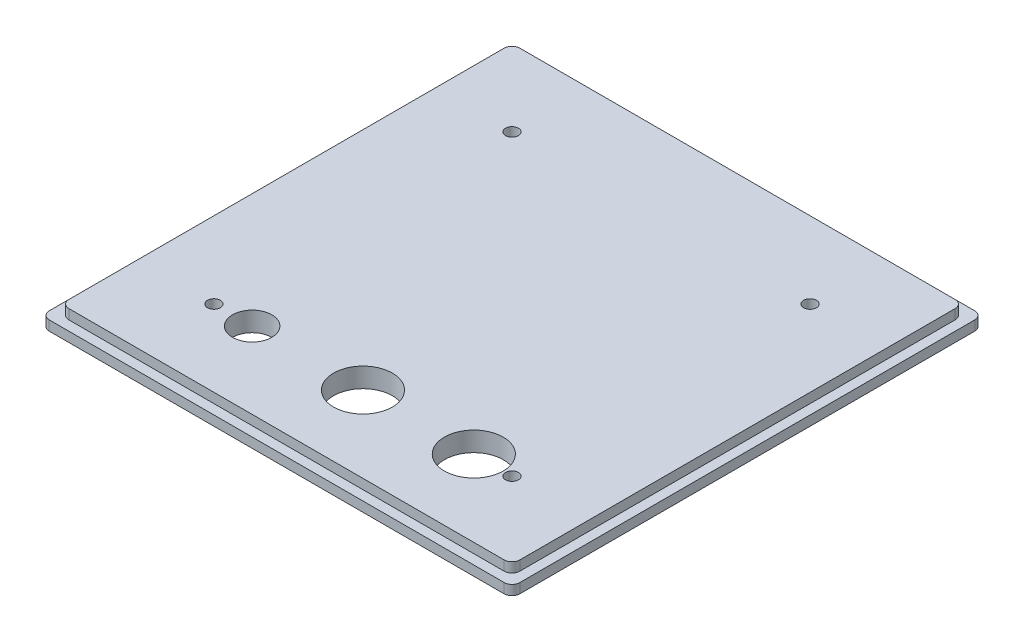
ISO-10303-21;
HEADER;
FILE_DESCRIPTION(('STEP AP214'),'2;1');
FILE_NAME('part.step','',(''),(''),'','','');
FILE_SCHEMA(('AUTOMOTIVE_DESIGN { 1 0 10303 214 1 1 1 1 }'));
ENDSEC;
DATA;
#1=APPLICATION_CONTEXT('core data for automotive mechanical design processes');
#2=APPLICATION_PROTOCOL_DEFINITION('international standard','automotive_design',2000,#1);
#3=PRODUCT_CONTEXT('',#1,'mechanical');
#4=PRODUCT('Part','Part','',(#3));
#5=PRODUCT_RELATED_PRODUCT_CATEGORY('part','',(#4));
#6=PRODUCT_DEFINITION_FORMATION('','',#4);
#7=PRODUCT_DEFINITION_CONTEXT('part definition',#1,'design');
#8=PRODUCT_DEFINITION('design','',#6,#7);
#9=PRODUCT_DEFINITION_SHAPE('','',#8);
#10=(LENGTH_UNIT() NAMED_UNIT(*) SI_UNIT(.MILLI.,.METRE.));
#11=(NAMED_UNIT(*) PLANE_ANGLE_UNIT() SI_UNIT($,.RADIAN.));
#12=(NAMED_UNIT(*) SI_UNIT($,.STERADIAN.) SOLID_ANGLE_UNIT());
#13=UNCERTAINTY_MEASURE_WITH_UNIT(LENGTH_MEASURE(1.E-05),#10,'distance_accuracy_value','');
#14=(GEOMETRIC_REPRESENTATION_CONTEXT(3) GLOBAL_UNCERTAINTY_ASSIGNED_CONTEXT((#13)) GLOBAL_UNIT_ASSIGNED_CONTEXT((#10,
#11,#12)) REPRESENTATION_CONTEXT('',''));
#15=CARTESIAN_POINT('',(0.,0.,0.));
#16=DIRECTION('',(0.,0.,1.));
#17=DIRECTION('',(1.,0.,0.));
#18=AXIS2_PLACEMENT_3D('',#15,#16,#17);
#19=CARTESIAN_POINT('',(38.005,-5.,-38.));
#20=DIRECTION('',(0.,1.,0.));
#21=DIRECTION('',(0.,0.,1.));
#22=AXIS2_PLACEMENT_3D('',#19,#20,#21);
#23=CYLINDRICAL_SURFACE('',#22,1.65);
#24=CARTESIAN_POINT('',(38.005,5.,-38.));
#25=DIRECTION('',(0.,1.,0.));
#26=DIRECTION('',(0.,0.,1.));
#27=AXIS2_PLACEMENT_3D('',#24,#25,#26);
#28=CIRCLE('',#27,1.65);
#29=CARTESIAN_POINT('',(38.005,5.,-36.35));
#30=VERTEX_POINT('',#29);
#31=EDGE_CURVE('E206',#30,#30,#28,.T.);
#32=ORIENTED_EDGE('',*,*,#31,.T.);
#33=EDGE_LOOP('',(#32));
#34=FACE_BOUND('',#33,.T.);
#35=CARTESIAN_POINT('',(38.005,2.40000000000001,-38.));
#36=DIRECTION('',(0.,-1.,0.));
#37=DIRECTION('',(1.,0.,0.));
#38=AXIS2_PLACEMENT_3D('',#35,#36,#37);
#39=CIRCLE('',#38,1.65);
#40=CARTESIAN_POINT('',(39.655,2.40000000000001,-38.));
#41=VERTEX_POINT('',#40);
#42=EDGE_CURVE('E213',#41,#41,#39,.F.);
#43=ORIENTED_EDGE('',*,*,#42,.F.);
#44=EDGE_LOOP('',(#43));
#45=FACE_BOUND('',#44,.T.);
#46=ADVANCED_FACE('F39',(#34,#45),#23,.F.);
#47=CARTESIAN_POINT('',(-38.005,-5.,-38.));
#48=DIRECTION('',(0.,1.,0.));
#49=DIRECTION('',(0.,0.,1.));
#50=AXIS2_PLACEMENT_3D('',#47,#48,#49);
#51=CYLINDRICAL_SURFACE('',#50,1.65);
#52=CARTESIAN_POINT('',(-38.005,5.,-38.));
#53=DIRECTION('',(0.,1.,0.));
#54=DIRECTION('',(0.,0.,1.));
#55=AXIS2_PLACEMENT_3D('',#52,#53,#54);
#56=CIRCLE('',#55,1.65);
#57=CARTESIAN_POINT('',(-38.005,5.,-36.35));
#58=VERTEX_POINT('',#57);
#59=EDGE_CURVE('E203',#58,#58,#56,.T.);
#60=ORIENTED_EDGE('',*,*,#59,.T.);
#61=EDGE_LOOP('',(#60));
#62=FACE_BOUND('',#61,.T.);
#63=CARTESIAN_POINT('',(-38.005,2.39999999999999,-38.));
#64=DIRECTION('',(0.,-1.,0.));
#65=DIRECTION('',(1.,0.,0.));
#66=AXIS2_PLACEMENT_3D('',#63,#64,#65);
#67=CIRCLE('',#66,1.65);
#68=CARTESIAN_POINT('',(-36.355,2.39999999999999,-38.));
#69=VERTEX_POINT('',#68);
#70=EDGE_CURVE('E338',#69,#69,#67,.F.);
#71=ORIENTED_EDGE('',*,*,#70,.F.);
#72=EDGE_LOOP('',(#71));
#73=FACE_BOUND('',#72,.T.);
#74=ADVANCED_FACE('F347',(#62,#73),#51,.F.);
#75=CARTESIAN_POINT('',(-38.005,-5.,38.));
#76=DIRECTION('',(0.,1.,0.));
#77=DIRECTION('',(0.,0.,1.));
#78=AXIS2_PLACEMENT_3D('',#75,#76,#77);
#79=CYLINDRICAL_SURFACE('',#78,1.65);
#80=CARTESIAN_POINT('',(-38.005,5.,38.));
#81=DIRECTION('',(0.,1.,0.));
#82=DIRECTION('',(0.,0.,1.));
#83=AXIS2_PLACEMENT_3D('',#80,#81,#82);
#84=CIRCLE('',#83,1.65);
#85=CARTESIAN_POINT('',(-38.005,5.,39.65));
#86=VERTEX_POINT('',#85);
#87=EDGE_CURVE('E207',#86,#86,#84,.T.);
#88=ORIENTED_EDGE('',*,*,#87,.T.);
#89=EDGE_LOOP('',(#88));
#90=FACE_BOUND('',#89,.T.);
#91=CARTESIAN_POINT('',(-38.005,2.39999999999999,38.));
#92=DIRECTION('',(0.,-1.,0.));
#93=DIRECTION('',(1.,0.,0.));
#94=AXIS2_PLACEMENT_3D('',#91,#92,#93);
#95=CIRCLE('',#94,1.65);
#96=CARTESIAN_POINT('',(-36.355,2.39999999999999,38.));
#97=VERTEX_POINT('',#96);
#98=EDGE_CURVE('E335',#97,#97,#95,.F.);
#99=ORIENTED_EDGE('',*,*,#98,.F.);
#100=EDGE_LOOP('',(#99));
#101=FACE_BOUND('',#100,.T.);
#102=ADVANCED_FACE('F353',(#90,#101),#79,.F.);
#103=CARTESIAN_POINT('',(38.005,-5.,38.));
#104=DIRECTION('',(0.,1.,0.));
#105=DIRECTION('',(0.,0.,1.));
#106=AXIS2_PLACEMENT_3D('',#103,#104,#105);
#107=CYLINDRICAL_SURFACE('',#106,1.65);
#108=CARTESIAN_POINT('',(38.005,5.,38.));
#109=DIRECTION('',(0.,1.,0.));
#110=DIRECTION('',(0.,0.,1.));
#111=AXIS2_PLACEMENT_3D('',#108,#109,#110);
#112=CIRCLE('',#111,1.65);
#113=CARTESIAN_POINT('',(38.005,5.,39.65));
#114=VERTEX_POINT('',#113);
#115=EDGE_CURVE('E210',#114,#114,#112,.T.);
#116=ORIENTED_EDGE('',*,*,#115,.T.);
#117=EDGE_LOOP('',(#116));
#118=FACE_BOUND('',#117,.T.);
#119=CARTESIAN_POINT('',(38.005,2.40000000000001,38.));
#120=DIRECTION('',(0.,-1.,0.));
#121=DIRECTION('',(1.,0.,0.));
#122=AXIS2_PLACEMENT_3D('',#119,#120,#121);
#123=CIRCLE('',#122,1.65);
#124=CARTESIAN_POINT('',(39.655,2.40000000000001,38.));
#125=VERTEX_POINT('',#124);
#126=EDGE_CURVE('E200',#125,#125,#123,.F.);
#127=ORIENTED_EDGE('',*,*,#126,.F.);
#128=EDGE_LOOP('',(#127));
#129=FACE_BOUND('',#128,.T.);
#130=ADVANCED_FACE('F358',(#118,#129),#107,.F.);
#131=CARTESIAN_POINT('',(60.,2.50000000000002,60.));
#132=DIRECTION('',(0.,-1.,0.));
#133=DIRECTION('',(1.,0.,0.));
#134=AXIS2_PLACEMENT_3D('',#131,#132,#133);
#135=PLANE('',#134);
#136=DIRECTION('',(-1.,0.,0.));
#137=VECTOR('',#136,1.);
#138=CARTESIAN_POINT('',(60.,2.50000000000002,-60.));
#139=LINE('',#138,#137);
#140=CARTESIAN_POINT('',(58.,2.50000000000002,-60.));
#141=VERTEX_POINT('',#140);
#142=CARTESIAN_POINT('',(-58.,2.49999999999999,-60.));
#143=VERTEX_POINT('',#142);
#144=EDGE_CURVE('E230',#141,#143,#139,.T.);
#145=ORIENTED_EDGE('',*,*,#144,.T.);
#146=CARTESIAN_POINT('',(-58.,2.49999999999999,-58.));
#147=DIRECTION('',(0.,-1.,0.));
#148=DIRECTION('',(1.,0.,0.));
#149=AXIS2_PLACEMENT_3D('',#146,#147,#148);
#150=CIRCLE('',#149,2.);
#151=CARTESIAN_POINT('',(-60.,2.49999999999999,-58.));
#152=VERTEX_POINT('',#151);
#153=EDGE_CURVE('E276',#143,#152,#150,.F.);
#154=ORIENTED_EDGE('',*,*,#153,.T.);
#155=DIRECTION('',(0.,0.,-1.));
#156=VECTOR('',#155,1.);
#157=CARTESIAN_POINT('',(-60.,2.49999999999999,60.));
#158=LINE('',#157,#156);
#159=CARTESIAN_POINT('',(-60.,2.49999999999999,58.));
#160=VERTEX_POINT('',#159);
#161=EDGE_CURVE('E261',#160,#152,#158,.T.);
#162=ORIENTED_EDGE('',*,*,#161,.F.);
#163=CARTESIAN_POINT('',(-58.,2.49999999999999,58.));
#164=DIRECTION('',(0.,-1.,0.));
#165=DIRECTION('',(1.,0.,0.));
#166=AXIS2_PLACEMENT_3D('',#163,#164,#165);
#167=CIRCLE('',#166,2.);
#168=CARTESIAN_POINT('',(-58.,2.49999999999999,60.));
#169=VERTEX_POINT('',#168);
#170=EDGE_CURVE('E274',#160,#169,#167,.F.);
#171=ORIENTED_EDGE('',*,*,#170,.T.);
#172=DIRECTION('',(-1.,0.,0.));
#173=VECTOR('',#172,1.);
#174=CARTESIAN_POINT('',(60.,2.50000000000002,60.));
#175=LINE('',#174,#173);
#176=CARTESIAN_POINT('',(58.,2.50000000000002,60.));
#177=VERTEX_POINT('',#176);
#178=EDGE_CURVE('E241',#177,#169,#175,.T.);
#179=ORIENTED_EDGE('',*,*,#178,.F.);
#180=CARTESIAN_POINT('',(58.,2.50000000000002,58.));
#181=DIRECTION('',(0.,-1.,0.));
#182=DIRECTION('',(1.,0.,0.));
#183=AXIS2_PLACEMENT_3D('',#180,#181,#182);
#184=CIRCLE('',#183,2.);
#185=CARTESIAN_POINT('',(60.,2.50000000000002,58.));
#186=VERTEX_POINT('',#185);
#187=EDGE_CURVE('E270',#177,#186,#184,.F.);
#188=ORIENTED_EDGE('',*,*,#187,.T.);
#189=DIRECTION('',(0.,0.,-1.));
#190=VECTOR('',#189,1.);
#191=CARTESIAN_POINT('',(60.,2.50000000000002,60.));
#192=LINE('',#191,#190);
#193=CARTESIAN_POINT('',(60.,2.50000000000002,-58.));
#194=VERTEX_POINT('',#193);
#195=EDGE_CURVE('E248',#186,#194,#192,.T.);
#196=ORIENTED_EDGE('',*,*,#195,.T.);
#197=CARTESIAN_POINT('',(58.,2.50000000000002,-58.));
#198=DIRECTION('',(0.,-1.,0.));
#199=DIRECTION('',(1.,0.,0.));
#200=AXIS2_PLACEMENT_3D('',#197,#198,#199);
#201=CIRCLE('',#200,2.);
#202=EDGE_CURVE('E272',#194,#141,#201,.F.);
#203=ORIENTED_EDGE('',*,*,#202,.T.);
#204=EDGE_LOOP('',(#145,#154,#162,#171,#179,#188,#196,#203));
#205=FACE_BOUND('',#204,.T.);
#206=DIRECTION('',(0.,0.,1.));
#207=VECTOR('',#206,1.);
#208=CARTESIAN_POINT('',(-57.5,2.5,-57.5));
#209=LINE('',#208,#207);
#210=CARTESIAN_POINT('',(-57.5,2.5,-55.5));
#211=VERTEX_POINT('',#210);
#212=CARTESIAN_POINT('',(-57.5,2.5,55.5));
#213=VERTEX_POINT('',#212);
#214=EDGE_CURVE('E216',#211,#213,#209,.T.);
#215=ORIENTED_EDGE('',*,*,#214,.F.);
#216=CARTESIAN_POINT('',(-55.5,2.49999999999999,-55.5));
#217=DIRECTION('',(0.,-1.,0.));
#218=DIRECTION('',(1.,0.,0.));
#219=AXIS2_PLACEMENT_3D('',#216,#217,#218);
#220=CIRCLE('',#219,2.);
#221=CARTESIAN_POINT('',(-55.5,2.5,-57.5));
#222=VERTEX_POINT('',#221);
#223=EDGE_CURVE('E329',#211,#222,#220,.T.);
#224=ORIENTED_EDGE('',*,*,#223,.T.);
#225=DIRECTION('',(1.,0.,0.));
#226=VECTOR('',#225,1.);
#227=CARTESIAN_POINT('',(-57.5,2.5,-57.5));
#228=LINE('',#227,#226);
#229=CARTESIAN_POINT('',(55.5,2.5,-57.5));
#230=VERTEX_POINT('',#229);
#231=EDGE_CURVE('E221',#222,#230,#228,.T.);
#232=ORIENTED_EDGE('',*,*,#231,.T.);
#233=CARTESIAN_POINT('',(55.5,2.50000000000002,-55.5));
#234=DIRECTION('',(0.,-1.,0.));
#235=DIRECTION('',(1.,0.,0.));
#236=AXIS2_PLACEMENT_3D('',#233,#234,#235);
#237=CIRCLE('',#236,2.);
#238=CARTESIAN_POINT('',(57.5,2.5,-55.5));
#239=VERTEX_POINT('',#238);
#240=EDGE_CURVE('E169',#230,#239,#237,.T.);
#241=ORIENTED_EDGE('',*,*,#240,.T.);
#242=DIRECTION('',(0.,0.,1.));
#243=VECTOR('',#242,1.);
#244=CARTESIAN_POINT('',(57.5,2.5,-57.5));
#245=LINE('',#244,#243);
#246=CARTESIAN_POINT('',(57.5,2.5,55.5));
#247=VERTEX_POINT('',#246);
#248=EDGE_CURVE('E236',#239,#247,#245,.T.);
#249=ORIENTED_EDGE('',*,*,#248,.T.);
#250=CARTESIAN_POINT('',(55.5,2.50000000000002,55.5));
#251=DIRECTION('',(0.,-1.,0.));
#252=DIRECTION('',(1.,0.,0.));
#253=AXIS2_PLACEMENT_3D('',#250,#251,#252);
#254=CIRCLE('',#253,2.);
#255=CARTESIAN_POINT('',(55.5,2.5,57.5));
#256=VERTEX_POINT('',#255);
#257=EDGE_CURVE('E62',#247,#256,#254,.T.);
#258=ORIENTED_EDGE('',*,*,#257,.T.);
#259=DIRECTION('',(-1.,0.,0.));
#260=VECTOR('',#259,1.);
#261=CARTESIAN_POINT('',(57.5,2.5,57.5));
#262=LINE('',#261,#260);
#263=CARTESIAN_POINT('',(-55.5,2.5,57.5));
#264=VERTEX_POINT('',#263);
#265=EDGE_CURVE('E233',#256,#264,#262,.T.);
#266=ORIENTED_EDGE('',*,*,#265,.T.);
#267=CARTESIAN_POINT('',(-55.5,2.49999999999999,55.5));
#268=DIRECTION('',(0.,-1.,0.));
#269=DIRECTION('',(1.,0.,0.));
#270=AXIS2_PLACEMENT_3D('',#267,#268,#269);
#271=CIRCLE('',#270,2.);
#272=EDGE_CURVE('E327',#264,#213,#271,.T.);
#273=ORIENTED_EDGE('',*,*,#272,.T.);
#274=EDGE_LOOP('',(#215,#224,#232,#241,#249,#258,#266,#273));
#275=FACE_BOUND('',#274,.T.);
#276=ADVANCED_FACE('F401',(#205,#275),#135,.F.);
#277=CARTESIAN_POINT('',(-60.,0.,60.));
#278=DIRECTION('',(-1.,0.,0.));
#279=DIRECTION('',(0.,0.,1.));
#280=AXIS2_PLACEMENT_3D('',#277,#278,#279);
#281=PLANE('',#280);
#282=ORIENTED_EDGE('',*,*,#161,.T.);
#283=DIRECTION('',(0.,1.,0.));
#284=VECTOR('',#283,1.);
#285=CARTESIAN_POINT('',(-60.,0.,-58.));
#286=LINE('',#285,#284);
#287=CARTESIAN_POINT('',(-60.,0.,-58.));
#288=VERTEX_POINT('',#287);
#289=EDGE_CURVE('E281',#152,#288,#286,.F.);
#290=ORIENTED_EDGE('',*,*,#289,.T.);
#291=DIRECTION('',(0.,0.,-1.));
#292=VECTOR('',#291,1.);
#293=CARTESIAN_POINT('',(-60.,0.,60.));
#294=LINE('',#293,#292);
#295=CARTESIAN_POINT('',(-60.,0.,58.));
#296=VERTEX_POINT('',#295);
#297=EDGE_CURVE('E258',#296,#288,#294,.T.);
#298=ORIENTED_EDGE('',*,*,#297,.F.);
#299=DIRECTION('',(0.,1.,0.));
#300=VECTOR('',#299,1.);
#301=CARTESIAN_POINT('',(-60.,2.49999999999999,58.));
#302=LINE('',#301,#300);
#303=EDGE_CURVE('E278',#296,#160,#302,.T.);
#304=ORIENTED_EDGE('',*,*,#303,.T.);
#305=EDGE_LOOP('',(#282,#290,#298,#304));
#306=FACE_BOUND('',#305,.T.);
#307=ADVANCED_FACE('F397',(#306),#281,.T.);
#308=CARTESIAN_POINT('',(60.,0.,60.));
#309=DIRECTION('',(0.,-1.,0.));
#310=DIRECTION('',(1.,0.,0.));
#311=AXIS2_PLACEMENT_3D('',#308,#309,#310);
#312=PLANE('',#311);
#313=CARTESIAN_POINT('',(-28.26,0.,38.));
#314=DIRECTION('',(0.,-1.,0.));
#315=DIRECTION('',(1.,0.,0.));
#316=AXIS2_PLACEMENT_3D('',#313,#314,#315);
#317=CIRCLE('',#316,5.);
#318=CARTESIAN_POINT('',(-23.26,0.,38.));
#319=VERTEX_POINT('',#318);
#320=EDGE_CURVE('E686',#319,#319,#317,.T.);
#321=ORIENTED_EDGE('',*,*,#320,.F.);
#322=EDGE_LOOP('',(#321));
#323=FACE_BOUND('',#322,.T.);
#324=CARTESIAN_POINT('',(28.26,0.,38.));
#325=DIRECTION('',(0.,-1.,0.));
#326=DIRECTION('',(1.,0.,0.));
#327=AXIS2_PLACEMENT_3D('',#324,#325,#326);
#328=CIRCLE('',#327,7.49999999999999);
#329=CARTESIAN_POINT('',(35.476650846588,0.,40.0420456798124));
#330=VERTEX_POINT('',#329);
#331=CARTESIAN_POINT('',(35.476650846588,0.,35.9579543201875));
#332=VERTEX_POINT('',#331);
#333=EDGE_CURVE('E164',#330,#332,#328,.T.);
#334=ORIENTED_EDGE('',*,*,#333,.F.);
#335=CARTESIAN_POINT('',(38.005,0.,38.));
#336=DIRECTION('',(0.,-1.,0.));
#337=DIRECTION('',(1.,0.,0.));
#338=AXIS2_PLACEMENT_3D('',#335,#336,#337);
#339=CIRCLE('',#338,3.25);
#340=EDGE_CURVE('E174',#332,#330,#339,.T.);
#341=ORIENTED_EDGE('',*,*,#340,.F.);
#342=EDGE_LOOP('',(#334,#341));
#343=FACE_BOUND('',#342,.T.);
#344=CARTESIAN_POINT('',(0.,0.,38.));
#345=DIRECTION('',(0.,-1.,0.));
#346=DIRECTION('',(1.,0.,0.));
#347=AXIS2_PLACEMENT_3D('',#344,#345,#346);
#348=CIRCLE('',#347,7.5);
#349=CARTESIAN_POINT('',(7.5,0.,38.));
#350=VERTEX_POINT('',#349);
#351=EDGE_CURVE('E693',#350,#350,#348,.T.);
#352=ORIENTED_EDGE('',*,*,#351,.F.);
#353=EDGE_LOOP('',(#352));
#354=FACE_BOUND('',#353,.T.);
#355=CARTESIAN_POINT('',(-38.005,0.,-38.));
#356=DIRECTION('',(0.,-1.,0.));
#357=DIRECTION('',(1.,0.,0.));
#358=AXIS2_PLACEMENT_3D('',#355,#356,#357);
#359=CIRCLE('',#358,3.25);
#360=CARTESIAN_POINT('',(-34.755,0.,-38.));
#361=VERTEX_POINT('',#360);
#362=EDGE_CURVE('E194',#361,#361,#359,.T.);
#363=ORIENTED_EDGE('',*,*,#362,.F.);
#364=EDGE_LOOP('',(#363));
#365=FACE_BOUND('',#364,.T.);
#366=CARTESIAN_POINT('',(38.005,0.,-38.));
#367=DIRECTION('',(0.,-1.,0.));
#368=DIRECTION('',(1.,0.,0.));
#369=AXIS2_PLACEMENT_3D('',#366,#367,#368);
#370=CIRCLE('',#369,3.25);
#371=CARTESIAN_POINT('',(41.255,0.,-38.));
#372=VERTEX_POINT('',#371);
#373=EDGE_CURVE('E185',#372,#372,#370,.T.);
#374=ORIENTED_EDGE('',*,*,#373,.F.);
#375=EDGE_LOOP('',(#374));
#376=FACE_BOUND('',#375,.T.);
#377=CARTESIAN_POINT('',(-38.005,0.,38.));
#378=DIRECTION('',(0.,-1.,0.));
#379=DIRECTION('',(1.,0.,0.));
#380=AXIS2_PLACEMENT_3D('',#377,#378,#379);
#381=CIRCLE('',#380,3.25);
#382=CARTESIAN_POINT('',(-34.755,0.,38.));
#383=VERTEX_POINT('',#382);
#384=EDGE_CURVE('E182',#383,#383,#381,.T.);
#385=ORIENTED_EDGE('',*,*,#384,.F.);
#386=EDGE_LOOP('',(#385));
#387=FACE_BOUND('',#386,.T.);
#388=ORIENTED_EDGE('',*,*,#297,.T.);
#389=CARTESIAN_POINT('',(-58.,0.,-58.));
#390=DIRECTION('',(0.,-1.,0.));
#391=DIRECTION('',(1.,0.,0.));
#392=AXIS2_PLACEMENT_3D('',#389,#390,#391);
#393=CIRCLE('',#392,2.);
#394=CARTESIAN_POINT('',(-58.,0.,-60.));
#395=VERTEX_POINT('',#394);
#396=EDGE_CURVE('E289',#288,#395,#393,.T.);
#397=ORIENTED_EDGE('',*,*,#396,.T.);
#398=DIRECTION('',(-1.,0.,0.));
#399=VECTOR('',#398,1.);
#400=CARTESIAN_POINT('',(60.,0.,-60.));
#401=LINE('',#400,#399);
#402=CARTESIAN_POINT('',(58.,0.,-60.));
#403=VERTEX_POINT('',#402);
#404=EDGE_CURVE('E245',#403,#395,#401,.T.);
#405=ORIENTED_EDGE('',*,*,#404,.F.);
#406=CARTESIAN_POINT('',(58.,0.,-58.));
#407=DIRECTION('',(0.,-1.,0.));
#408=DIRECTION('',(1.,0.,0.));
#409=AXIS2_PLACEMENT_3D('',#406,#407,#408);
#410=CIRCLE('',#409,2.);
#411=CARTESIAN_POINT('',(60.,0.,-58.));
#412=VERTEX_POINT('',#411);
#413=EDGE_CURVE('E285',#403,#412,#410,.T.);
#414=ORIENTED_EDGE('',*,*,#413,.T.);
#415=DIRECTION('',(0.,0.,-1.));
#416=VECTOR('',#415,1.);
#417=CARTESIAN_POINT('',(60.,0.,60.));
#418=LINE('',#417,#416);
#419=CARTESIAN_POINT('',(60.,0.,58.));
#420=VERTEX_POINT('',#419);
#421=EDGE_CURVE('E255',#420,#412,#418,.T.);
#422=ORIENTED_EDGE('',*,*,#421,.F.);
#423=CARTESIAN_POINT('',(58.,0.,58.));
#424=DIRECTION('',(0.,-1.,0.));
#425=DIRECTION('',(1.,0.,0.));
#426=AXIS2_PLACEMENT_3D('',#423,#424,#425);
#427=CIRCLE('',#426,2.);
#428=CARTESIAN_POINT('',(58.,0.,60.));
#429=VERTEX_POINT('',#428);
#430=EDGE_CURVE('E283',#420,#429,#427,.T.);
#431=ORIENTED_EDGE('',*,*,#430,.T.);
#432=DIRECTION('',(-1.,0.,0.));
#433=VECTOR('',#432,1.);
#434=CARTESIAN_POINT('',(60.,0.,60.));
#435=LINE('',#434,#433);
#436=CARTESIAN_POINT('',(-58.,0.,60.));
#437=VERTEX_POINT('',#436);
#438=EDGE_CURVE('E244',#429,#437,#435,.T.);
#439=ORIENTED_EDGE('',*,*,#438,.T.);
#440=CARTESIAN_POINT('',(-58.,0.,58.));
#441=DIRECTION('',(0.,-1.,0.));
#442=DIRECTION('',(1.,0.,0.));
#443=AXIS2_PLACEMENT_3D('',#440,#441,#442);
#444=CIRCLE('',#443,2.);
#445=EDGE_CURVE('E287',#437,#296,#444,.T.);
#446=ORIENTED_EDGE('',*,*,#445,.T.);
#447=EDGE_LOOP('',(#388,#397,#405,#414,#422,#431,#439,#446));
#448=FACE_BOUND('',#447,.T.);
#449=ADVANCED_FACE('F172',(#323,#343,#354,#365,#376,#387,#448),#312,.T.);
#450=CARTESIAN_POINT('',(60.,2.50000000000002,60.));
#451=DIRECTION('',(1.,0.,0.));
#452=DIRECTION('',(0.,0.,-1.));
#453=AXIS2_PLACEMENT_3D('',#450,#451,#452);
#454=PLANE('',#453);
#455=ORIENTED_EDGE('',*,*,#421,.T.);
#456=DIRECTION('',(0.,-1.,0.));
#457=VECTOR('',#456,1.);
#458=CARTESIAN_POINT('',(60.,2.50000000000002,-58.));
#459=LINE('',#458,#457);
#460=EDGE_CURVE('E298',#412,#194,#459,.F.);
#461=ORIENTED_EDGE('',*,*,#460,.T.);
#462=ORIENTED_EDGE('',*,*,#195,.F.);
#463=DIRECTION('',(0.,-1.,0.));
#464=VECTOR('',#463,1.);
#465=CARTESIAN_POINT('',(60.,0.,58.));
#466=LINE('',#465,#464);
#467=EDGE_CURVE('E295',#186,#420,#466,.T.);
#468=ORIENTED_EDGE('',*,*,#467,.T.);
#469=EDGE_LOOP('',(#455,#461,#462,#468));
#470=FACE_BOUND('',#469,.T.);
#471=ADVANCED_FACE('F386',(#470),#454,.T.);
#472=CARTESIAN_POINT('',(0.,0.,60.));
#473=DIRECTION('',(0.,0.,-1.));
#474=DIRECTION('',(-1.,0.,0.));
#475=AXIS2_PLACEMENT_3D('',#472,#473,#474);
#476=PLANE('',#475);
#477=ORIENTED_EDGE('',*,*,#178,.T.);
#478=DIRECTION('',(0.,1.,0.));
#479=VECTOR('',#478,1.);
#480=CARTESIAN_POINT('',(-58.,0.,60.));
#481=LINE('',#480,#479);
#482=EDGE_CURVE('E293',#169,#437,#481,.F.);
#483=ORIENTED_EDGE('',*,*,#482,.T.);
#484=ORIENTED_EDGE('',*,*,#438,.F.);
#485=DIRECTION('',(0.,-1.,0.));
#486=VECTOR('',#485,1.);
#487=CARTESIAN_POINT('',(58.,2.50000000000002,60.));
#488=LINE('',#487,#486);
#489=EDGE_CURVE('E291',#429,#177,#488,.F.);
#490=ORIENTED_EDGE('',*,*,#489,.T.);
#491=EDGE_LOOP('',(#477,#483,#484,#490));
#492=FACE_BOUND('',#491,.T.);
#493=ADVANCED_FACE('F382',(#492),#476,.F.);
#494=CARTESIAN_POINT('',(0.,0.,-60.));
#495=DIRECTION('',(0.,0.,-1.));
#496=DIRECTION('',(-1.,0.,0.));
#497=AXIS2_PLACEMENT_3D('',#494,#495,#496);
#498=PLANE('',#497);
#499=ORIENTED_EDGE('',*,*,#404,.T.);
#500=DIRECTION('',(0.,1.,0.));
#501=VECTOR('',#500,1.);
#502=CARTESIAN_POINT('',(-58.,0.,-60.));
#503=LINE('',#502,#501);
#504=EDGE_CURVE('E267',#395,#143,#503,.T.);
#505=ORIENTED_EDGE('',*,*,#504,.T.);
#506=ORIENTED_EDGE('',*,*,#144,.F.);
#507=DIRECTION('',(0.,-1.,0.));
#508=VECTOR('',#507,1.);
#509=CARTESIAN_POINT('',(58.,0.,-60.));
#510=LINE('',#509,#508);
#511=EDGE_CURVE('E264',#141,#403,#510,.T.);
#512=ORIENTED_EDGE('',*,*,#511,.T.);
#513=EDGE_LOOP('',(#499,#505,#506,#512));
#514=FACE_BOUND('',#513,.T.);
#515=ADVANCED_FACE('F385',(#514),#498,.T.);
#516=CARTESIAN_POINT('',(-58.,0.,-58.));
#517=DIRECTION('',(0.,1.,0.));
#518=DIRECTION('',(0.,0.,1.));
#519=AXIS2_PLACEMENT_3D('',#516,#517,#518);
#520=CYLINDRICAL_SURFACE('',#519,2.);
#521=ORIENTED_EDGE('',*,*,#396,.F.);
#522=ORIENTED_EDGE('',*,*,#289,.F.);
#523=ORIENTED_EDGE('',*,*,#153,.F.);
#524=ORIENTED_EDGE('',*,*,#504,.F.);
#525=EDGE_LOOP('',(#521,#522,#523,#524));
#526=FACE_BOUND('',#525,.T.);
#527=ADVANCED_FACE('F390',(#526),#520,.T.);
#528=CARTESIAN_POINT('',(-58.,0.,58.));
#529=DIRECTION('',(0.,-1.,0.));
#530=DIRECTION('',(0.,0.,-1.));
#531=AXIS2_PLACEMENT_3D('',#528,#529,#530);
#532=CYLINDRICAL_SURFACE('',#531,2.);
#533=ORIENTED_EDGE('',*,*,#445,.F.);
#534=ORIENTED_EDGE('',*,*,#482,.F.);
#535=ORIENTED_EDGE('',*,*,#170,.F.);
#536=ORIENTED_EDGE('',*,*,#303,.F.);
#537=EDGE_LOOP('',(#533,#534,#535,#536));
#538=FACE_BOUND('',#537,.T.);
#539=ADVANCED_FACE('F408',(#538),#532,.T.);
#540=CARTESIAN_POINT('',(58.,0.,-58.));
#541=DIRECTION('',(0.,-1.,0.));
#542=DIRECTION('',(0.,0.,-1.));
#543=AXIS2_PLACEMENT_3D('',#540,#541,#542);
#544=CYLINDRICAL_SURFACE('',#543,2.);
#545=ORIENTED_EDGE('',*,*,#202,.F.);
#546=ORIENTED_EDGE('',*,*,#460,.F.);
#547=ORIENTED_EDGE('',*,*,#413,.F.);
#548=ORIENTED_EDGE('',*,*,#511,.F.);
#549=EDGE_LOOP('',(#545,#546,#547,#548));
#550=FACE_BOUND('',#549,.T.);
#551=ADVANCED_FACE('F412',(#550),#544,.T.);
#552=CARTESIAN_POINT('',(58.,2.50000000000002,58.));
#553=DIRECTION('',(0.,1.,0.));
#554=DIRECTION('',(0.,0.,1.));
#555=AXIS2_PLACEMENT_3D('',#552,#553,#554);
#556=CYLINDRICAL_SURFACE('',#555,2.);
#557=ORIENTED_EDGE('',*,*,#187,.F.);
#558=ORIENTED_EDGE('',*,*,#489,.F.);
#559=ORIENTED_EDGE('',*,*,#430,.F.);
#560=ORIENTED_EDGE('',*,*,#467,.F.);
#561=EDGE_LOOP('',(#557,#558,#559,#560));
#562=FACE_BOUND('',#561,.T.);
#563=ADVANCED_FACE('F380',(#562),#556,.T.);
#564=CARTESIAN_POINT('',(-57.5,5.,-57.5));
#565=DIRECTION('',(1.,0.,0.));
#566=DIRECTION('',(0.,0.,-1.));
#567=AXIS2_PLACEMENT_3D('',#564,#565,#566);
#568=PLANE('',#567);
#569=ORIENTED_EDGE('',*,*,#214,.T.);
#570=DIRECTION('',(0.,-1.,0.));
#571=VECTOR('',#570,1.);
#572=CARTESIAN_POINT('',(-57.5,5.,55.5));
#573=LINE('',#572,#571);
#574=CARTESIAN_POINT('',(-57.5,5.,55.5));
#575=VERTEX_POINT('',#574);
#576=EDGE_CURVE('E308',#213,#575,#573,.F.);
#577=ORIENTED_EDGE('',*,*,#576,.T.);
#578=DIRECTION('',(0.,0.,1.));
#579=VECTOR('',#578,1.);
#580=CARTESIAN_POINT('',(-57.5,5.,-57.5));
#581=LINE('',#580,#579);
#582=CARTESIAN_POINT('',(-57.5,5.,-55.5));
#583=VERTEX_POINT('',#582);
#584=EDGE_CURVE('E217',#583,#575,#581,.T.);
#585=ORIENTED_EDGE('',*,*,#584,.F.);
#586=DIRECTION('',(0.,-1.,0.));
#587=VECTOR('',#586,1.);
#588=CARTESIAN_POINT('',(-57.5,2.5,-55.5));
#589=LINE('',#588,#587);
#590=EDGE_CURVE('E305',#583,#211,#589,.T.);
#591=ORIENTED_EDGE('',*,*,#590,.T.);
#592=EDGE_LOOP('',(#569,#577,#585,#591));
#593=FACE_BOUND('',#592,.T.);
#594=ADVANCED_FACE('F376',(#593),#568,.F.);
#595=CARTESIAN_POINT('',(57.5,5.,57.5));
#596=DIRECTION('',(0.,0.,1.));
#597=DIRECTION('',(1.,0.,0.));
#598=AXIS2_PLACEMENT_3D('',#595,#596,#597);
#599=PLANE('',#598);
#600=DIRECTION('',(-1.,0.,0.));
#601=VECTOR('',#600,1.);
#602=CARTESIAN_POINT('',(57.5,5.,57.5));
#603=LINE('',#602,#601);
#604=CARTESIAN_POINT('',(55.5,5.,57.5));
#605=VERTEX_POINT('',#604);
#606=CARTESIAN_POINT('',(-55.5,5.,57.5));
#607=VERTEX_POINT('',#606);
#608=EDGE_CURVE('E220',#605,#607,#603,.T.);
#609=ORIENTED_EDGE('',*,*,#608,.T.);
#610=DIRECTION('',(0.,-1.,0.));
#611=VECTOR('',#610,1.);
#612=CARTESIAN_POINT('',(-55.5,2.5,57.5));
#613=LINE('',#612,#611);
#614=EDGE_CURVE('E302',#607,#264,#613,.T.);
#615=ORIENTED_EDGE('',*,*,#614,.T.);
#616=ORIENTED_EDGE('',*,*,#265,.F.);
#617=DIRECTION('',(0.,-1.,0.));
#618=VECTOR('',#617,1.);
#619=CARTESIAN_POINT('',(55.5,5.,57.5));
#620=LINE('',#619,#618);
#621=EDGE_CURVE('E300',#256,#605,#620,.F.);
#622=ORIENTED_EDGE('',*,*,#621,.T.);
#623=EDGE_LOOP('',(#609,#615,#616,#622));
#624=FACE_BOUND('',#623,.T.);
#625=ADVANCED_FACE('F372',(#624),#599,.T.);
#626=CARTESIAN_POINT('',(57.5,5.,-57.5));
#627=DIRECTION('',(1.,0.,0.));
#628=DIRECTION('',(0.,0.,-1.));
#629=AXIS2_PLACEMENT_3D('',#626,#627,#628);
#630=PLANE('',#629);
#631=DIRECTION('',(0.,0.,1.));
#632=VECTOR('',#631,1.);
#633=CARTESIAN_POINT('',(57.5,5.,-57.5));
#634=LINE('',#633,#632);
#635=CARTESIAN_POINT('',(57.5,5.,-55.5));
#636=VERTEX_POINT('',#635);
#637=CARTESIAN_POINT('',(57.5,5.,55.5));
#638=VERTEX_POINT('',#637);
#639=EDGE_CURVE('E224',#636,#638,#634,.T.);
#640=ORIENTED_EDGE('',*,*,#639,.T.);
#641=DIRECTION('',(0.,-1.,0.));
#642=VECTOR('',#641,1.);
#643=CARTESIAN_POINT('',(57.5,5.,55.5));
#644=LINE('',#643,#642);
#645=EDGE_CURVE('E325',#638,#247,#644,.T.);
#646=ORIENTED_EDGE('',*,*,#645,.T.);
#647=ORIENTED_EDGE('',*,*,#248,.F.);
#648=DIRECTION('',(0.,-1.,0.));
#649=VECTOR('',#648,1.);
#650=CARTESIAN_POINT('',(57.5,5.,-55.5));
#651=LINE('',#650,#649);
#652=EDGE_CURVE('E323',#239,#636,#651,.F.);
#653=ORIENTED_EDGE('',*,*,#652,.T.);
#654=EDGE_LOOP('',(#640,#646,#647,#653));
#655=FACE_BOUND('',#654,.T.);
#656=ADVANCED_FACE('F368',(#655),#630,.T.);
#657=CARTESIAN_POINT('',(-57.5,5.,-57.5));
#658=DIRECTION('',(0.,0.,-1.));
#659=DIRECTION('',(-1.,0.,0.));
#660=AXIS2_PLACEMENT_3D('',#657,#658,#659);
#661=PLANE('',#660);
#662=ORIENTED_EDGE('',*,*,#231,.F.);
#663=DIRECTION('',(0.,-1.,0.));
#664=VECTOR('',#663,1.);
#665=CARTESIAN_POINT('',(-55.5,5.,-57.5));
#666=LINE('',#665,#664);
#667=CARTESIAN_POINT('',(-55.5,5.,-57.5));
#668=VERTEX_POINT('',#667);
#669=EDGE_CURVE('E321',#222,#668,#666,.F.);
#670=ORIENTED_EDGE('',*,*,#669,.T.);
#671=DIRECTION('',(1.,0.,0.));
#672=VECTOR('',#671,1.);
#673=CARTESIAN_POINT('',(-57.5,5.,-57.5));
#674=LINE('',#673,#672);
#675=CARTESIAN_POINT('',(55.5,5.,-57.5));
#676=VERTEX_POINT('',#675);
#677=EDGE_CURVE('E227',#668,#676,#674,.T.);
#678=ORIENTED_EDGE('',*,*,#677,.T.);
#679=DIRECTION('',(0.,-1.,0.));
#680=VECTOR('',#679,1.);
#681=CARTESIAN_POINT('',(55.5,5.,-57.5));
#682=LINE('',#681,#680);
#683=EDGE_CURVE('E318',#676,#230,#682,.T.);
#684=ORIENTED_EDGE('',*,*,#683,.T.);
#685=EDGE_LOOP('',(#662,#670,#678,#684));
#686=FACE_BOUND('',#685,.T.);
#687=ADVANCED_FACE('F364',(#686),#661,.T.);
#688=CARTESIAN_POINT('',(0.,5.,0.));
#689=DIRECTION('',(0.,-1.,0.));
#690=DIRECTION('',(-1.,0.,0.));
#691=AXIS2_PLACEMENT_3D('',#688,#689,#690);
#692=PLANE('',#691);
#693=CARTESIAN_POINT('',(-28.26,5.00000000000001,38.));
#694=DIRECTION('',(0.,-1.,0.));
#695=DIRECTION('',(1.,0.,0.));
#696=AXIS2_PLACEMENT_3D('',#693,#694,#695);
#697=CIRCLE('',#696,5.);
#698=CARTESIAN_POINT('',(-23.26,5.00000000000002,38.));
#699=VERTEX_POINT('',#698);
#700=EDGE_CURVE('E176',#699,#699,#697,.T.);
#701=ORIENTED_EDGE('',*,*,#700,.T.);
#702=EDGE_LOOP('',(#701));
#703=FACE_BOUND('',#702,.T.);
#704=CARTESIAN_POINT('',(28.26,5.00000000000003,38.));
#705=DIRECTION('',(0.,-1.,0.));
#706=DIRECTION('',(1.,0.,0.));
#707=AXIS2_PLACEMENT_3D('',#704,#705,#706);
#708=CIRCLE('',#707,7.49999999999999);
#709=CARTESIAN_POINT('',(35.76,5.00000000000003,38.));
#710=VERTEX_POINT('',#709);
#711=EDGE_CURVE('E175',#710,#710,#708,.T.);
#712=ORIENTED_EDGE('',*,*,#711,.T.);
#713=EDGE_LOOP('',(#712));
#714=FACE_BOUND('',#713,.T.);
#715=CARTESIAN_POINT('',(0.,5.00000000000002,38.));
#716=DIRECTION('',(0.,-1.,0.));
#717=DIRECTION('',(1.,0.,0.));
#718=AXIS2_PLACEMENT_3D('',#715,#716,#717);
#719=CIRCLE('',#718,7.5);
#720=CARTESIAN_POINT('',(7.5,5.00000000000002,38.));
#721=VERTEX_POINT('',#720);
#722=EDGE_CURVE('E690',#721,#721,#719,.T.);
#723=ORIENTED_EDGE('',*,*,#722,.T.);
#724=EDGE_LOOP('',(#723));
#725=FACE_BOUND('',#724,.T.);
#726=ORIENTED_EDGE('',*,*,#115,.F.);
#727=EDGE_LOOP('',(#726));
#728=FACE_BOUND('',#727,.T.);
#729=ORIENTED_EDGE('',*,*,#87,.F.);
#730=EDGE_LOOP('',(#729));
#731=FACE_BOUND('',#730,.T.);
#732=ORIENTED_EDGE('',*,*,#59,.F.);
#733=EDGE_LOOP('',(#732));
#734=FACE_BOUND('',#733,.T.);
#735=ORIENTED_EDGE('',*,*,#31,.F.);
#736=EDGE_LOOP('',(#735));
#737=FACE_BOUND('',#736,.T.);
#738=ORIENTED_EDGE('',*,*,#584,.T.);
#739=CARTESIAN_POINT('',(-55.5,5.,55.5));
#740=DIRECTION('',(0.,-1.,0.));
#741=DIRECTION('',(0.,0.,-1.));
#742=AXIS2_PLACEMENT_3D('',#739,#740,#741);
#743=CIRCLE('',#742,2.);
#744=EDGE_CURVE('E316',#575,#607,#743,.F.);
#745=ORIENTED_EDGE('',*,*,#744,.T.);
#746=ORIENTED_EDGE('',*,*,#608,.F.);
#747=CARTESIAN_POINT('',(55.5,5.,55.5));
#748=DIRECTION('',(0.,-1.,0.));
#749=DIRECTION('',(0.,0.,-1.));
#750=AXIS2_PLACEMENT_3D('',#747,#748,#749);
#751=CIRCLE('',#750,2.);
#752=EDGE_CURVE('E312',#605,#638,#751,.F.);
#753=ORIENTED_EDGE('',*,*,#752,.T.);
#754=ORIENTED_EDGE('',*,*,#639,.F.);
#755=CARTESIAN_POINT('',(55.5,5.,-55.5));
#756=DIRECTION('',(0.,-1.,0.));
#757=DIRECTION('',(0.,0.,-1.));
#758=AXIS2_PLACEMENT_3D('',#755,#756,#757);
#759=CIRCLE('',#758,2.);
#760=EDGE_CURVE('E310',#636,#676,#759,.F.);
#761=ORIENTED_EDGE('',*,*,#760,.T.);
#762=ORIENTED_EDGE('',*,*,#677,.F.);
#763=CARTESIAN_POINT('',(-55.5,5.,-55.5));
#764=DIRECTION('',(0.,-1.,0.));
#765=DIRECTION('',(0.,0.,-1.));
#766=AXIS2_PLACEMENT_3D('',#763,#764,#765);
#767=CIRCLE('',#766,2.);
#768=EDGE_CURVE('E314',#668,#583,#767,.F.);
#769=ORIENTED_EDGE('',*,*,#768,.T.);
#770=EDGE_LOOP('',(#738,#745,#746,#753,#754,#761,#762,#769));
#771=FACE_BOUND('',#770,.T.);
#772=ADVANCED_FACE('F360',(#703,#714,#725,#728,#731,#734,#737,#771),#692,.F.);
#773=CARTESIAN_POINT('',(-55.5,5.,55.5));
#774=DIRECTION('',(0.,1.,0.));
#775=DIRECTION('',(0.,0.,1.));
#776=AXIS2_PLACEMENT_3D('',#773,#774,#775);
#777=CYLINDRICAL_SURFACE('',#776,2.);
#778=ORIENTED_EDGE('',*,*,#744,.F.);
#779=ORIENTED_EDGE('',*,*,#576,.F.);
#780=ORIENTED_EDGE('',*,*,#272,.F.);
#781=ORIENTED_EDGE('',*,*,#614,.F.);
#782=EDGE_LOOP('',(#778,#779,#780,#781));
#783=FACE_BOUND('',#782,.T.);
#784=ADVANCED_FACE('F363',(#783),#777,.T.);
#785=CARTESIAN_POINT('',(-55.5,5.,-55.5));
#786=DIRECTION('',(0.,1.,0.));
#787=DIRECTION('',(0.,0.,1.));
#788=AXIS2_PLACEMENT_3D('',#785,#786,#787);
#789=CYLINDRICAL_SURFACE('',#788,2.);
#790=ORIENTED_EDGE('',*,*,#768,.F.);
#791=ORIENTED_EDGE('',*,*,#669,.F.);
#792=ORIENTED_EDGE('',*,*,#223,.F.);
#793=ORIENTED_EDGE('',*,*,#590,.F.);
#794=EDGE_LOOP('',(#790,#791,#792,#793));
#795=FACE_BOUND('',#794,.T.);
#796=ADVANCED_FACE('F422',(#795),#789,.T.);
#797=CARTESIAN_POINT('',(55.5,5.,55.5));
#798=DIRECTION('',(0.,-1.,0.));
#799=DIRECTION('',(0.,0.,-1.));
#800=AXIS2_PLACEMENT_3D('',#797,#798,#799);
#801=CYLINDRICAL_SURFACE('',#800,2.);
#802=ORIENTED_EDGE('',*,*,#752,.F.);
#803=ORIENTED_EDGE('',*,*,#621,.F.);
#804=ORIENTED_EDGE('',*,*,#257,.F.);
#805=ORIENTED_EDGE('',*,*,#645,.F.);
#806=EDGE_LOOP('',(#802,#803,#804,#805));
#807=FACE_BOUND('',#806,.T.);
#808=ADVANCED_FACE('F425',(#807),#801,.T.);
#809=CARTESIAN_POINT('',(55.5,5.,-55.5));
#810=DIRECTION('',(0.,-1.,0.));
#811=DIRECTION('',(0.,0.,-1.));
#812=AXIS2_PLACEMENT_3D('',#809,#810,#811);
#813=CYLINDRICAL_SURFACE('',#812,2.);
#814=ORIENTED_EDGE('',*,*,#760,.F.);
#815=ORIENTED_EDGE('',*,*,#652,.F.);
#816=ORIENTED_EDGE('',*,*,#240,.F.);
#817=ORIENTED_EDGE('',*,*,#683,.F.);
#818=EDGE_LOOP('',(#814,#815,#816,#817));
#819=FACE_BOUND('',#818,.T.);
#820=ADVANCED_FACE('F41',(#819),#813,.T.);
#821=CARTESIAN_POINT('',(38.005,2.40000000000001,38.));
#822=DIRECTION('',(0.,-1.,0.));
#823=DIRECTION('',(1.,0.,0.));
#824=AXIS2_PLACEMENT_3D('',#821,#822,#823);
#825=PLANE('',#824);
#826=CARTESIAN_POINT('',(28.26,2.40000000000001,38.));
#827=DIRECTION('',(0.,-1.,0.));
#828=DIRECTION('',(1.,0.,0.));
#829=AXIS2_PLACEMENT_3D('',#826,#827,#828);
#830=CIRCLE('',#829,7.49999999999999);
#831=CARTESIAN_POINT('',(35.476650846588,2.40000000000001,35.9579543201875));
#832=VERTEX_POINT('',#831);
#833=CARTESIAN_POINT('',(35.476650846588,2.40000000000001,40.0420456798124));
#834=VERTEX_POINT('',#833);
#835=EDGE_CURVE('E54',#832,#834,#830,.T.);
#836=ORIENTED_EDGE('',*,*,#835,.F.);
#837=CARTESIAN_POINT('',(38.005,2.40000000000001,38.));
#838=DIRECTION('',(0.,-1.,0.));
#839=DIRECTION('',(1.,0.,0.));
#840=AXIS2_PLACEMENT_3D('',#837,#838,#839);
#841=CIRCLE('',#840,3.25);
#842=EDGE_CURVE('E179',#832,#834,#841,.T.);
#843=ORIENTED_EDGE('',*,*,#842,.T.);
#844=EDGE_LOOP('',(#836,#843));
#845=FACE_BOUND('',#844,.T.);
#846=ORIENTED_EDGE('',*,*,#126,.T.);
#847=EDGE_LOOP('',(#846));
#848=FACE_BOUND('',#847,.T.);
#849=ADVANCED_FACE('F431',(#845,#848),#825,.T.);
#850=CARTESIAN_POINT('',(38.005,2.40000000000001,38.));
#851=DIRECTION('',(0.,-1.,0.));
#852=DIRECTION('',(1.,0.,0.));
#853=AXIS2_PLACEMENT_3D('',#850,#851,#852);
#854=CYLINDRICAL_SURFACE('',#853,3.25);
#855=ORIENTED_EDGE('',*,*,#842,.F.);
#856=DIRECTION('',(0.,-1.,0.));
#857=VECTOR('',#856,1.);
#858=CARTESIAN_POINT('',(35.476650846588,2.50000000000002,35.9579543201875));
#859=LINE('',#858,#857);
#860=EDGE_CURVE('E11',#832,#332,#859,.T.);
#861=ORIENTED_EDGE('',*,*,#860,.T.);
#862=ORIENTED_EDGE('',*,*,#340,.T.);
#863=DIRECTION('',(0.,-1.,0.));
#864=VECTOR('',#863,1.);
#865=CARTESIAN_POINT('',(35.476650846588,2.50000000000002,40.0420456798124));
#866=LINE('',#865,#864);
#867=EDGE_CURVE('E47',#330,#834,#866,.F.);
#868=ORIENTED_EDGE('',*,*,#867,.T.);
#869=EDGE_LOOP('',(#855,#861,#862,#868));
#870=FACE_BOUND('',#869,.T.);
#871=ADVANCED_FACE('F178',(#870),#854,.F.);
#872=CARTESIAN_POINT('',(-38.005,2.39999999999999,38.));
#873=DIRECTION('',(0.,-1.,0.));
#874=DIRECTION('',(1.,0.,0.));
#875=AXIS2_PLACEMENT_3D('',#872,#873,#874);
#876=PLANE('',#875);
#877=CARTESIAN_POINT('',(-38.005,2.39999999999999,38.));
#878=DIRECTION('',(0.,-1.,0.));
#879=DIRECTION('',(1.,0.,0.));
#880=AXIS2_PLACEMENT_3D('',#877,#878,#879);
#881=CIRCLE('',#880,3.25);
#882=CARTESIAN_POINT('',(-34.755,2.39999999999999,38.));
#883=VERTEX_POINT('',#882);
#884=EDGE_CURVE('E197',#883,#883,#881,.T.);
#885=ORIENTED_EDGE('',*,*,#884,.T.);
#886=EDGE_LOOP('',(#885));
#887=FACE_BOUND('',#886,.T.);
#888=ORIENTED_EDGE('',*,*,#98,.T.);
#889=EDGE_LOOP('',(#888));
#890=FACE_BOUND('',#889,.T.);
#891=ADVANCED_FACE('F461',(#887,#890),#876,.T.);
#892=CARTESIAN_POINT('',(-38.005,2.39999999999999,38.));
#893=DIRECTION('',(0.,-1.,0.));
#894=DIRECTION('',(1.,0.,0.));
#895=AXIS2_PLACEMENT_3D('',#892,#893,#894);
#896=CYLINDRICAL_SURFACE('',#895,3.25);
#897=ORIENTED_EDGE('',*,*,#884,.F.);
#898=EDGE_LOOP('',(#897));
#899=FACE_BOUND('',#898,.T.);
#900=ORIENTED_EDGE('',*,*,#384,.T.);
#901=EDGE_LOOP('',(#900));
#902=FACE_BOUND('',#901,.T.);
#903=ADVANCED_FACE('F479',(#899,#902),#896,.F.);
#904=CARTESIAN_POINT('',(-38.005,2.39999999999999,-38.));
#905=DIRECTION('',(0.,-1.,0.));
#906=DIRECTION('',(1.,0.,0.));
#907=AXIS2_PLACEMENT_3D('',#904,#905,#906);
#908=PLANE('',#907);
#909=CARTESIAN_POINT('',(-38.005,2.39999999999999,-38.));
#910=DIRECTION('',(0.,-1.,0.));
#911=DIRECTION('',(1.,0.,0.));
#912=AXIS2_PLACEMENT_3D('',#909,#910,#911);
#913=CIRCLE('',#912,3.25);
#914=CARTESIAN_POINT('',(-34.755,2.39999999999999,-38.));
#915=VERTEX_POINT('',#914);
#916=EDGE_CURVE('E191',#915,#915,#913,.T.);
#917=ORIENTED_EDGE('',*,*,#916,.T.);
#918=EDGE_LOOP('',(#917));
#919=FACE_BOUND('',#918,.T.);
#920=ORIENTED_EDGE('',*,*,#70,.T.);
#921=EDGE_LOOP('',(#920));
#922=FACE_BOUND('',#921,.T.);
#923=ADVANCED_FACE('F476',(#919,#922),#908,.T.);
#924=CARTESIAN_POINT('',(-38.005,2.39999999999999,-38.));
#925=DIRECTION('',(0.,-1.,0.));
#926=DIRECTION('',(1.,0.,0.));
#927=AXIS2_PLACEMENT_3D('',#924,#925,#926);
#928=CYLINDRICAL_SURFACE('',#927,3.25);
#929=ORIENTED_EDGE('',*,*,#916,.F.);
#930=EDGE_LOOP('',(#929));
#931=FACE_BOUND('',#930,.T.);
#932=ORIENTED_EDGE('',*,*,#362,.T.);
#933=EDGE_LOOP('',(#932));
#934=FACE_BOUND('',#933,.T.);
#935=ADVANCED_FACE('F471',(#931,#934),#928,.F.);
#936=CARTESIAN_POINT('',(38.005,2.40000000000001,-38.));
#937=DIRECTION('',(0.,-1.,0.));
#938=DIRECTION('',(1.,0.,0.));
#939=AXIS2_PLACEMENT_3D('',#936,#937,#938);
#940=PLANE('',#939);
#941=CARTESIAN_POINT('',(38.005,2.40000000000001,-38.));
#942=DIRECTION('',(0.,-1.,0.));
#943=DIRECTION('',(1.,0.,0.));
#944=AXIS2_PLACEMENT_3D('',#941,#942,#943);
#945=CIRCLE('',#944,3.25);
#946=CARTESIAN_POINT('',(41.255,2.40000000000001,-38.));
#947=VERTEX_POINT('',#946);
#948=EDGE_CURVE('E180',#947,#947,#945,.T.);
#949=ORIENTED_EDGE('',*,*,#948,.T.);
#950=EDGE_LOOP('',(#949));
#951=FACE_BOUND('',#950,.T.);
#952=ORIENTED_EDGE('',*,*,#42,.T.);
#953=EDGE_LOOP('',(#952));
#954=FACE_BOUND('',#953,.T.);
#955=ADVANCED_FACE('F344',(#951,#954),#940,.T.);
#956=CARTESIAN_POINT('',(38.005,2.40000000000001,-38.));
#957=DIRECTION('',(0.,-1.,0.));
#958=DIRECTION('',(1.,0.,0.));
#959=AXIS2_PLACEMENT_3D('',#956,#957,#958);
#960=CYLINDRICAL_SURFACE('',#959,3.25);
#961=ORIENTED_EDGE('',*,*,#948,.F.);
#962=EDGE_LOOP('',(#961));
#963=FACE_BOUND('',#962,.T.);
#964=ORIENTED_EDGE('',*,*,#373,.T.);
#965=EDGE_LOOP('',(#964));
#966=FACE_BOUND('',#965,.T.);
#967=ADVANCED_FACE('F470',(#963,#966),#960,.F.);
#968=CARTESIAN_POINT('',(28.26,5.00000000000003,38.));
#969=DIRECTION('',(0.,-1.,0.));
#970=DIRECTION('',(1.,0.,0.));
#971=AXIS2_PLACEMENT_3D('',#968,#969,#970);
#972=CYLINDRICAL_SURFACE('',#971,7.49999999999999);
#973=ORIENTED_EDGE('',*,*,#711,.F.);
#974=EDGE_LOOP('',(#973));
#975=FACE_BOUND('',#974,.T.);
#976=ORIENTED_EDGE('',*,*,#835,.T.);
#977=ORIENTED_EDGE('',*,*,#867,.F.);
#978=ORIENTED_EDGE('',*,*,#333,.T.);
#979=ORIENTED_EDGE('',*,*,#860,.F.);
#980=EDGE_LOOP('',(#976,#977,#978,#979));
#981=FACE_BOUND('',#980,.T.);
#982=ADVANCED_FACE('F163',(#975,#981),#972,.F.);
#983=CARTESIAN_POINT('',(0.,5.00000000000002,38.));
#984=DIRECTION('',(0.,-1.,0.));
#985=DIRECTION('',(1.,0.,0.));
#986=AXIS2_PLACEMENT_3D('',#983,#984,#985);
#987=CYLINDRICAL_SURFACE('',#986,7.5);
#988=ORIENTED_EDGE('',*,*,#722,.F.);
#989=EDGE_LOOP('',(#988));
#990=FACE_BOUND('',#989,.T.);
#991=ORIENTED_EDGE('',*,*,#351,.T.);
#992=EDGE_LOOP('',(#991));
#993=FACE_BOUND('',#992,.T.);
#994=ADVANCED_FACE('F465',(#990,#993),#987,.F.);
#995=CARTESIAN_POINT('',(-28.26,5.00000000000001,38.));
#996=DIRECTION('',(0.,-1.,0.));
#997=DIRECTION('',(1.,0.,0.));
#998=AXIS2_PLACEMENT_3D('',#995,#996,#997);
#999=CYLINDRICAL_SURFACE('',#998,5.);
#1000=ORIENTED_EDGE('',*,*,#700,.F.);
#1001=EDGE_LOOP('',(#1000));
#1002=FACE_BOUND('',#1001,.T.);
#1003=ORIENTED_EDGE('',*,*,#320,.T.);
#1004=EDGE_LOOP('',(#1003));
#1005=FACE_BOUND('',#1004,.T.);
#1006=ADVANCED_FACE('F662',(#1002,#1005),#999,.F.);
#1007=CLOSED_SHELL('',(#46,#74,#102,#130,#276,#307,#449,#471,#493,#515,#527,#539,#551,#563,#594,
#625,#656,#687,#772,#784,#796,#808,#820,#849,#871,#891,#903,#923,#935,#955,#967,#982,#994,#1006));
#1008=MANIFOLD_SOLID_BREP('B2',#1007);
#1009=ADVANCED_BREP_SHAPE_REPRESENTATION('',(#18,#1008),#14);
#1010=SHAPE_DEFINITION_REPRESENTATION(#9,#1009);
ENDSEC;
END-ISO-10303-21;
